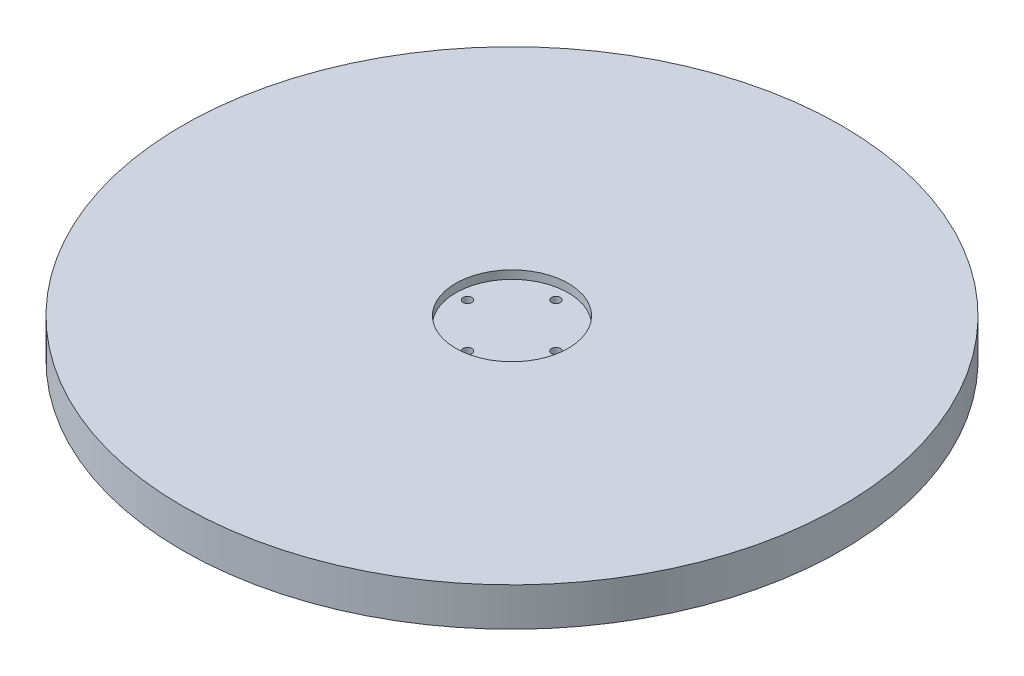
ISO-10303-21;
HEADER;
FILE_DESCRIPTION(('STEP AP214'),'2;1');
FILE_NAME('part.step','',(''),(''),'','','');
FILE_SCHEMA(('AUTOMOTIVE_DESIGN { 1 0 10303 214 1 1 1 1 }'));
ENDSEC;
DATA;
#1=APPLICATION_CONTEXT('core data for automotive mechanical design processes');
#2=APPLICATION_PROTOCOL_DEFINITION('international standard','automotive_design',2000,#1);
#3=PRODUCT_CONTEXT('',#1,'mechanical');
#4=PRODUCT('Part','Part','',(#3));
#5=PRODUCT_RELATED_PRODUCT_CATEGORY('part','',(#4));
#6=PRODUCT_DEFINITION_FORMATION('','',#4);
#7=PRODUCT_DEFINITION_CONTEXT('part definition',#1,'design');
#8=PRODUCT_DEFINITION('design','',#6,#7);
#9=PRODUCT_DEFINITION_SHAPE('','',#8);
#10=(LENGTH_UNIT() NAMED_UNIT(*) SI_UNIT(.MILLI.,.METRE.));
#11=(NAMED_UNIT(*) PLANE_ANGLE_UNIT() SI_UNIT($,.RADIAN.));
#12=(NAMED_UNIT(*) SI_UNIT($,.STERADIAN.) SOLID_ANGLE_UNIT());
#13=UNCERTAINTY_MEASURE_WITH_UNIT(LENGTH_MEASURE(1.E-05),#10,'distance_accuracy_value','');
#14=(GEOMETRIC_REPRESENTATION_CONTEXT(3) GLOBAL_UNCERTAINTY_ASSIGNED_CONTEXT((#13)) GLOBAL_UNIT_ASSIGNED_CONTEXT((#10,
#11,#12)) REPRESENTATION_CONTEXT('',''));
#15=CARTESIAN_POINT('',(0.,0.,0.));
#16=DIRECTION('',(0.,0.,1.));
#17=DIRECTION('',(1.,0.,0.));
#18=AXIS2_PLACEMENT_3D('',#15,#16,#17);
#19=CARTESIAN_POINT('',(0.,0.,0.));
#20=DIRECTION('',(0.,1.,0.));
#21=DIRECTION('',(0.,0.,1.));
#22=AXIS2_PLACEMENT_3D('',#19,#20,#21);
#23=PLANE('',#22);
#24=CARTESIAN_POINT('',(0.,0.,-8.));
#25=DIRECTION('',(0.,1.,0.));
#26=DIRECTION('',(0.,0.,1.));
#27=AXIS2_PLACEMENT_3D('',#24,#25,#26);
#28=CIRCLE('',#27,0.799999999999999);
#29=CARTESIAN_POINT('',(0.,0.,-7.2));
#30=VERTEX_POINT('',#29);
#31=EDGE_CURVE('E62',#30,#30,#28,.T.);
#32=ORIENTED_EDGE('',*,*,#31,.T.);
#33=EDGE_LOOP('',(#32));
#34=FACE_BOUND('',#33,.T.);
#35=CARTESIAN_POINT('',(8.04903157844334,0.,0.0490315784432575));
#36=DIRECTION('',(0.,1.,0.));
#37=DIRECTION('',(-1.,0.,0.));
#38=AXIS2_PLACEMENT_3D('',#35,#36,#37);
#39=CIRCLE('',#38,0.799999999999999);
#40=CARTESIAN_POINT('',(7.24903157844334,0.,0.0490315784432659));
#41=VERTEX_POINT('',#40);
#42=EDGE_CURVE('E79',#41,#41,#39,.T.);
#43=ORIENTED_EDGE('',*,*,#42,.T.);
#44=EDGE_LOOP('',(#43));
#45=FACE_BOUND('',#44,.T.);
#46=CARTESIAN_POINT('',(0.,0.,8.09806315688668));
#47=DIRECTION('',(0.,1.,0.));
#48=DIRECTION('',(0.,0.,-1.));
#49=AXIS2_PLACEMENT_3D('',#46,#47,#48);
#50=CIRCLE('',#49,0.799999999999999);
#51=CARTESIAN_POINT('',(0.,0.,7.29806315688668));
#52=VERTEX_POINT('',#51);
#53=EDGE_CURVE('E78',#52,#52,#50,.T.);
#54=ORIENTED_EDGE('',*,*,#53,.T.);
#55=EDGE_LOOP('',(#54));
#56=FACE_BOUND('',#55,.T.);
#57=CARTESIAN_POINT('',(-8.04903157844334,0.,0.0490315784433699));
#58=DIRECTION('',(0.,1.,0.));
#59=DIRECTION('',(1.,0.,0.));
#60=AXIS2_PLACEMENT_3D('',#57,#58,#59);
#61=CIRCLE('',#60,0.799999999999999);
#62=CARTESIAN_POINT('',(-7.24903157844334,0.,0.0490315784433671));
#63=VERTEX_POINT('',#62);
#64=EDGE_CURVE('E88',#63,#63,#61,.T.);
#65=ORIENTED_EDGE('',*,*,#64,.T.);
#66=EDGE_LOOP('',(#65));
#67=FACE_BOUND('',#66,.T.);
#68=CARTESIAN_POINT('',(0.,0.,0.));
#69=DIRECTION('',(0.,-1.,0.));
#70=DIRECTION('',(1.,0.,0.));
#71=AXIS2_PLACEMENT_3D('',#68,#69,#70);
#72=CIRCLE('',#71,25.);
#73=CARTESIAN_POINT('',(25.,0.,0.));
#74=VERTEX_POINT('',#73);
#75=EDGE_CURVE('E106',#74,#74,#72,.T.);
#76=ORIENTED_EDGE('',*,*,#75,.T.);
#77=EDGE_LOOP('',(#76));
#78=FACE_BOUND('',#77,.T.);
#79=ADVANCED_FACE('F43',(#34,#45,#56,#67,#78),#23,.F.);
#80=CARTESIAN_POINT('',(0.,7.,0.));
#81=DIRECTION('',(0.,-1.,0.));
#82=DIRECTION('',(0.,0.,-1.));
#83=AXIS2_PLACEMENT_3D('',#80,#81,#82);
#84=CYLINDRICAL_SURFACE('',#83,60.);
#85=CARTESIAN_POINT('',(0.,7.,0.));
#86=DIRECTION('',(0.,1.,0.));
#87=DIRECTION('',(0.,0.,1.));
#88=AXIS2_PLACEMENT_3D('',#85,#86,#87);
#89=CIRCLE('',#88,60.);
#90=CARTESIAN_POINT('',(0.,7.,60.));
#91=VERTEX_POINT('',#90);
#92=EDGE_CURVE('E11',#91,#91,#89,.T.);
#93=ORIENTED_EDGE('',*,*,#92,.F.);
#94=EDGE_LOOP('',(#93));
#95=FACE_BOUND('',#94,.T.);
#96=CARTESIAN_POINT('',(0.,0.,0.));
#97=DIRECTION('',(0.,1.,0.));
#98=DIRECTION('',(0.,0.,1.));
#99=AXIS2_PLACEMENT_3D('',#96,#97,#98);
#100=CIRCLE('',#99,60.);
#101=CARTESIAN_POINT('',(0.,0.,60.));
#102=VERTEX_POINT('',#101);
#103=EDGE_CURVE('E47',#102,#102,#100,.T.);
#104=ORIENTED_EDGE('',*,*,#103,.T.);
#105=EDGE_LOOP('',(#104));
#106=FACE_BOUND('',#105,.T.);
#107=ADVANCED_FACE('F45',(#95,#106),#84,.T.);
#108=CARTESIAN_POINT('',(0.,7.,0.));
#109=DIRECTION('',(0.,1.,0.));
#110=DIRECTION('',(0.,0.,1.));
#111=AXIS2_PLACEMENT_3D('',#108,#109,#110);
#112=PLANE('',#111);
#113=CARTESIAN_POINT('',(0.,7.,0.));
#114=DIRECTION('',(0.,1.,0.));
#115=DIRECTION('',(0.,0.,1.));
#116=AXIS2_PLACEMENT_3D('',#113,#114,#115);
#117=CIRCLE('',#116,10.25);
#118=CARTESIAN_POINT('',(0.,7.,10.25));
#119=VERTEX_POINT('',#118);
#120=EDGE_CURVE('E58',#119,#119,#117,.T.);
#121=ORIENTED_EDGE('',*,*,#120,.F.);
#122=EDGE_LOOP('',(#121));
#123=FACE_BOUND('',#122,.T.);
#124=ORIENTED_EDGE('',*,*,#92,.T.);
#125=EDGE_LOOP('',(#124));
#126=FACE_BOUND('',#125,.T.);
#127=ADVANCED_FACE('F134',(#123,#126),#112,.T.);
#128=CARTESIAN_POINT('',(0.,0.,0.));
#129=DIRECTION('',(0.,-1.,0.));
#130=DIRECTION('',(0.,0.,-1.));
#131=AXIS2_PLACEMENT_3D('',#128,#129,#130);
#132=CIRCLE('',#131,35.);
#133=CARTESIAN_POINT('',(0.,0.,-35.));
#134=VERTEX_POINT('',#133);
#135=EDGE_CURVE('E98',#134,#134,#132,.T.);
#136=ORIENTED_EDGE('',*,*,#135,.F.);
#137=EDGE_LOOP('',(#136));
#138=FACE_BOUND('',#137,.T.);
#139=ORIENTED_EDGE('',*,*,#103,.F.);
#140=EDGE_LOOP('',(#139));
#141=FACE_BOUND('',#140,.T.);
#142=ADVANCED_FACE('F130',(#138,#141),#23,.F.);
#143=CARTESIAN_POINT('',(0.,5.5,0.));
#144=DIRECTION('',(0.,1.,0.));
#145=DIRECTION('',(0.,0.,1.));
#146=AXIS2_PLACEMENT_3D('',#143,#144,#145);
#147=CYLINDRICAL_SURFACE('',#146,10.25);
#148=CARTESIAN_POINT('',(0.,5.5,0.));
#149=DIRECTION('',(0.,1.,0.));
#150=DIRECTION('',(0.,0.,1.));
#151=AXIS2_PLACEMENT_3D('',#148,#149,#150);
#152=CIRCLE('',#151,10.25);
#153=CARTESIAN_POINT('',(0.,5.5,10.25));
#154=VERTEX_POINT('',#153);
#155=EDGE_CURVE('E56',#154,#154,#152,.T.);
#156=ORIENTED_EDGE('',*,*,#155,.F.);
#157=EDGE_LOOP('',(#156));
#158=FACE_BOUND('',#157,.T.);
#159=ORIENTED_EDGE('',*,*,#120,.T.);
#160=EDGE_LOOP('',(#159));
#161=FACE_BOUND('',#160,.T.);
#162=ADVANCED_FACE('F133',(#158,#161),#147,.F.);
#163=CARTESIAN_POINT('',(0.,5.5,0.));
#164=DIRECTION('',(0.,1.,0.));
#165=DIRECTION('',(0.,0.,1.));
#166=AXIS2_PLACEMENT_3D('',#163,#164,#165);
#167=PLANE('',#166);
#168=CARTESIAN_POINT('',(-8.04903157844334,5.5,0.0490315784433699));
#169=DIRECTION('',(0.,1.,0.));
#170=DIRECTION('',(1.,0.,0.));
#171=AXIS2_PLACEMENT_3D('',#168,#169,#170);
#172=CIRCLE('',#171,0.8);
#173=CARTESIAN_POINT('',(-7.24903157844334,5.5,0.0490315784433671));
#174=VERTEX_POINT('',#173);
#175=EDGE_CURVE('E73',#174,#174,#172,.T.);
#176=ORIENTED_EDGE('',*,*,#175,.F.);
#177=EDGE_LOOP('',(#176));
#178=FACE_BOUND('',#177,.T.);
#179=CARTESIAN_POINT('',(0.,5.5,8.09806315688668));
#180=DIRECTION('',(0.,1.,0.));
#181=DIRECTION('',(0.,0.,-1.));
#182=AXIS2_PLACEMENT_3D('',#179,#180,#181);
#183=CIRCLE('',#182,0.8);
#184=CARTESIAN_POINT('',(0.,5.5,7.29806315688668));
#185=VERTEX_POINT('',#184);
#186=EDGE_CURVE('E84',#185,#185,#183,.T.);
#187=ORIENTED_EDGE('',*,*,#186,.F.);
#188=EDGE_LOOP('',(#187));
#189=FACE_BOUND('',#188,.T.);
#190=CARTESIAN_POINT('',(8.04903157844334,5.5,0.0490315784432575));
#191=DIRECTION('',(0.,1.,0.));
#192=DIRECTION('',(-1.,0.,0.));
#193=AXIS2_PLACEMENT_3D('',#190,#191,#192);
#194=CIRCLE('',#193,0.8);
#195=CARTESIAN_POINT('',(7.24903157844334,5.5,0.0490315784432659));
#196=VERTEX_POINT('',#195);
#197=EDGE_CURVE('E74',#196,#196,#194,.T.);
#198=ORIENTED_EDGE('',*,*,#197,.F.);
#199=EDGE_LOOP('',(#198));
#200=FACE_BOUND('',#199,.T.);
#201=CARTESIAN_POINT('',(0.,5.5,-8.));
#202=DIRECTION('',(0.,1.,0.));
#203=DIRECTION('',(0.,0.,1.));
#204=AXIS2_PLACEMENT_3D('',#201,#202,#203);
#205=CIRCLE('',#204,0.8);
#206=CARTESIAN_POINT('',(0.,5.5,-7.2));
#207=VERTEX_POINT('',#206);
#208=EDGE_CURVE('E69',#207,#207,#205,.T.);
#209=ORIENTED_EDGE('',*,*,#208,.F.);
#210=EDGE_LOOP('',(#209));
#211=FACE_BOUND('',#210,.T.);
#212=ORIENTED_EDGE('',*,*,#155,.T.);
#213=EDGE_LOOP('',(#212));
#214=FACE_BOUND('',#213,.T.);
#215=ADVANCED_FACE('F152',(#178,#189,#200,#211,#214),#167,.T.);
#216=CARTESIAN_POINT('',(0.,5.5,-8.));
#217=DIRECTION('',(0.,1.,0.));
#218=DIRECTION('',(0.,0.,1.));
#219=AXIS2_PLACEMENT_3D('',#216,#217,#218);
#220=CYLINDRICAL_SURFACE('',#219,0.799999999999999);
#221=ORIENTED_EDGE('',*,*,#31,.F.);
#222=EDGE_LOOP('',(#221));
#223=FACE_BOUND('',#222,.T.);
#224=ORIENTED_EDGE('',*,*,#208,.T.);
#225=EDGE_LOOP('',(#224));
#226=FACE_BOUND('',#225,.T.);
#227=ADVANCED_FACE('F156',(#223,#226),#220,.F.);
#228=CARTESIAN_POINT('',(8.04903157844334,5.5,0.0490315784432575));
#229=DIRECTION('',(0.,1.,0.));
#230=DIRECTION('',(-1.,0.,0.));
#231=AXIS2_PLACEMENT_3D('',#228,#229,#230);
#232=CYLINDRICAL_SURFACE('',#231,0.799999999999999);
#233=ORIENTED_EDGE('',*,*,#42,.F.);
#234=EDGE_LOOP('',(#233));
#235=FACE_BOUND('',#234,.T.);
#236=ORIENTED_EDGE('',*,*,#197,.T.);
#237=EDGE_LOOP('',(#236));
#238=FACE_BOUND('',#237,.T.);
#239=ADVANCED_FACE('F160',(#235,#238),#232,.F.);
#240=CARTESIAN_POINT('',(0.,5.5,8.09806315688668));
#241=DIRECTION('',(0.,1.,0.));
#242=DIRECTION('',(0.,0.,-1.));
#243=AXIS2_PLACEMENT_3D('',#240,#241,#242);
#244=CYLINDRICAL_SURFACE('',#243,0.799999999999999);
#245=ORIENTED_EDGE('',*,*,#53,.F.);
#246=EDGE_LOOP('',(#245));
#247=FACE_BOUND('',#246,.T.);
#248=ORIENTED_EDGE('',*,*,#186,.T.);
#249=EDGE_LOOP('',(#248));
#250=FACE_BOUND('',#249,.T.);
#251=ADVANCED_FACE('F164',(#247,#250),#244,.F.);
#252=CARTESIAN_POINT('',(-8.04903157844334,5.5,0.0490315784433699));
#253=DIRECTION('',(0.,1.,0.));
#254=DIRECTION('',(1.,0.,0.));
#255=AXIS2_PLACEMENT_3D('',#252,#253,#254);
#256=CYLINDRICAL_SURFACE('',#255,0.799999999999999);
#257=ORIENTED_EDGE('',*,*,#64,.F.);
#258=EDGE_LOOP('',(#257));
#259=FACE_BOUND('',#258,.T.);
#260=ORIENTED_EDGE('',*,*,#175,.T.);
#261=EDGE_LOOP('',(#260));
#262=FACE_BOUND('',#261,.T.);
#263=ADVANCED_FACE('F126',(#259,#262),#256,.F.);
#264=CARTESIAN_POINT('',(0.,4.,0.));
#265=DIRECTION('',(0.,-1.,0.));
#266=DIRECTION('',(0.,0.,-1.));
#267=AXIS2_PLACEMENT_3D('',#264,#265,#266);
#268=CYLINDRICAL_SURFACE('',#267,35.);
#269=CARTESIAN_POINT('',(0.,4.,0.));
#270=DIRECTION('',(0.,-1.,0.));
#271=DIRECTION('',(0.,0.,-1.));
#272=AXIS2_PLACEMENT_3D('',#269,#270,#271);
#273=CIRCLE('',#272,35.);
#274=CARTESIAN_POINT('',(0.,4.,-35.));
#275=VERTEX_POINT('',#274);
#276=EDGE_CURVE('E83',#275,#275,#273,.T.);
#277=ORIENTED_EDGE('',*,*,#276,.F.);
#278=EDGE_LOOP('',(#277));
#279=FACE_BOUND('',#278,.T.);
#280=ORIENTED_EDGE('',*,*,#135,.T.);
#281=EDGE_LOOP('',(#280));
#282=FACE_BOUND('',#281,.T.);
#283=ADVANCED_FACE('F120',(#279,#282),#268,.F.);
#284=CARTESIAN_POINT('',(0.,4.,0.));
#285=DIRECTION('',(0.,-1.,0.));
#286=DIRECTION('',(0.,0.,-1.));
#287=AXIS2_PLACEMENT_3D('',#284,#285,#286);
#288=PLANE('',#287);
#289=CARTESIAN_POINT('',(0.,4.,0.));
#290=DIRECTION('',(0.,-1.,0.));
#291=DIRECTION('',(1.,0.,0.));
#292=AXIS2_PLACEMENT_3D('',#289,#290,#291);
#293=CIRCLE('',#292,25.);
#294=CARTESIAN_POINT('',(25.,4.,0.));
#295=VERTEX_POINT('',#294);
#296=EDGE_CURVE('E102',#295,#295,#293,.T.);
#297=ORIENTED_EDGE('',*,*,#296,.F.);
#298=EDGE_LOOP('',(#297));
#299=FACE_BOUND('',#298,.T.);
#300=ORIENTED_EDGE('',*,*,#276,.T.);
#301=EDGE_LOOP('',(#300));
#302=FACE_BOUND('',#301,.T.);
#303=ADVANCED_FACE('F117',(#299,#302),#288,.T.);
#304=CARTESIAN_POINT('',(0.,4.,0.));
#305=DIRECTION('',(0.,-1.,0.));
#306=DIRECTION('',(0.,0.,-1.));
#307=AXIS2_PLACEMENT_3D('',#304,#305,#306);
#308=CYLINDRICAL_SURFACE('',#307,25.);
#309=ORIENTED_EDGE('',*,*,#296,.T.);
#310=EDGE_LOOP('',(#309));
#311=FACE_BOUND('',#310,.T.);
#312=ORIENTED_EDGE('',*,*,#75,.F.);
#313=EDGE_LOOP('',(#312));
#314=FACE_BOUND('',#313,.T.);
#315=ADVANCED_FACE('F114',(#311,#314),#308,.T.);
#316=CLOSED_SHELL('',(#79,#107,#127,#142,#162,#215,#227,#239,#251,#263,#283,#303,#315));
#317=MANIFOLD_SOLID_BREP('B2',#316);
#318=ADVANCED_BREP_SHAPE_REPRESENTATION('',(#18,#317),#14);
#319=SHAPE_DEFINITION_REPRESENTATION(#9,#318);
ENDSEC;
END-ISO-10303-21;
